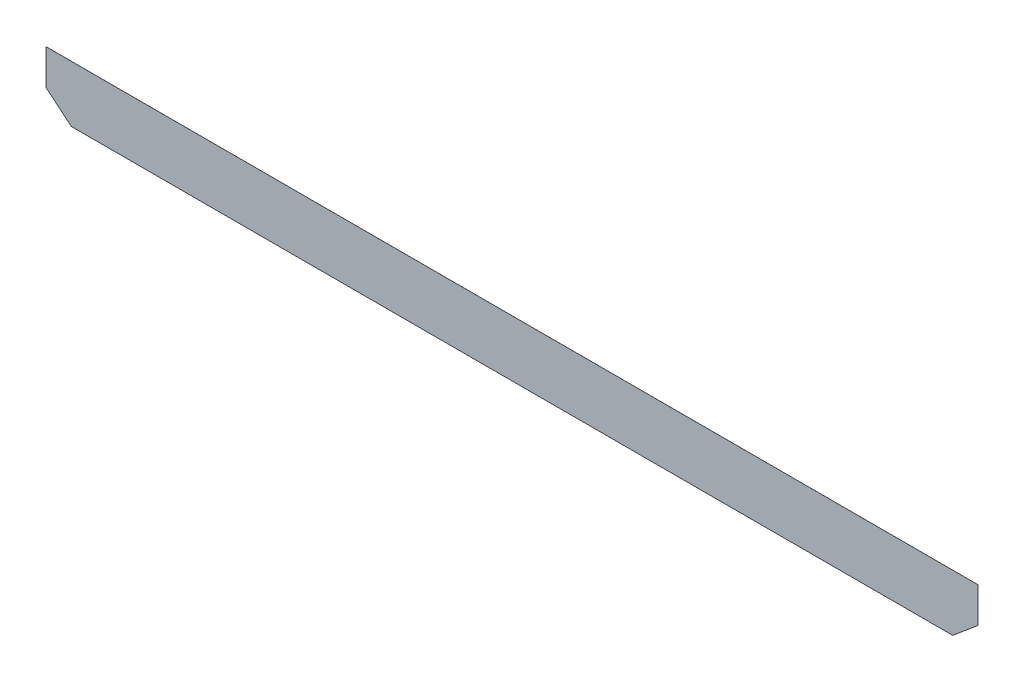
ISO-10303-21;
HEADER;
FILE_DESCRIPTION(('STEP AP214'),'2;1');
FILE_NAME('part.step','',(''),(''),'','','');
FILE_SCHEMA(('AUTOMOTIVE_DESIGN { 1 0 10303 214 1 1 1 1 }'));
ENDSEC;
DATA;
#1=APPLICATION_CONTEXT('core data for automotive mechanical design processes');
#2=APPLICATION_PROTOCOL_DEFINITION('international standard','automotive_design',2000,#1);
#3=PRODUCT_CONTEXT('',#1,'mechanical');
#4=PRODUCT('Part','Part','',(#3));
#5=PRODUCT_RELATED_PRODUCT_CATEGORY('part','',(#4));
#6=PRODUCT_DEFINITION_FORMATION('','',#4);
#7=PRODUCT_DEFINITION_CONTEXT('part definition',#1,'design');
#8=PRODUCT_DEFINITION('design','',#6,#7);
#9=PRODUCT_DEFINITION_SHAPE('','',#8);
#10=(LENGTH_UNIT() NAMED_UNIT(*) SI_UNIT(.MILLI.,.METRE.));
#11=(NAMED_UNIT(*) PLANE_ANGLE_UNIT() SI_UNIT($,.RADIAN.));
#12=(NAMED_UNIT(*) SI_UNIT($,.STERADIAN.) SOLID_ANGLE_UNIT());
#13=UNCERTAINTY_MEASURE_WITH_UNIT(LENGTH_MEASURE(1.E-05),#10,'distance_accuracy_value','');
#14=(GEOMETRIC_REPRESENTATION_CONTEXT(3) GLOBAL_UNCERTAINTY_ASSIGNED_CONTEXT((#13)) GLOBAL_UNIT_ASSIGNED_CONTEXT((#10,
#11,#12)) REPRESENTATION_CONTEXT('',''));
#15=CARTESIAN_POINT('',(0.,0.,0.));
#16=DIRECTION('',(0.,0.,1.));
#17=DIRECTION('',(1.,0.,0.));
#18=AXIS2_PLACEMENT_3D('',#15,#16,#17);
#19=CARTESIAN_POINT('',(0.,0.,0.001));
#20=DIRECTION('',(0.,1.,0.));
#21=DIRECTION('',(0.,0.,1.));
#22=AXIS2_PLACEMENT_3D('',#19,#20,#21);
#23=PLANE('',#22);
#24=DIRECTION('',(0.,0.,-1.));
#25=VECTOR('',#24,1.);
#26=CARTESIAN_POINT('',(32.1061848055544,0.,1.));
#27=LINE('',#26,#25);
#28=CARTESIAN_POINT('',(32.1061848055544,0.,0.000999999999999916));
#29=VERTEX_POINT('',#28);
#30=CARTESIAN_POINT('',(32.1061848055544,0.,0.));
#31=VERTEX_POINT('',#30);
#32=EDGE_CURVE('E55',#29,#31,#27,.T.);
#33=ORIENTED_EDGE('',*,*,#32,.F.);
#34=DIRECTION('',(1.,0.,0.));
#35=VECTOR('',#34,1.);
#36=CARTESIAN_POINT('',(0.,0.,0.001));
#37=LINE('',#36,#35);
#38=CARTESIAN_POINT('',(0.893815194445653,0.,0.000999999999999916));
#39=VERTEX_POINT('',#38);
#40=EDGE_CURVE('E137',#39,#29,#37,.T.);
#41=ORIENTED_EDGE('',*,*,#40,.F.);
#42=DIRECTION('',(0.,0.,-1.));
#43=VECTOR('',#42,1.);
#44=CARTESIAN_POINT('',(0.893815194445653,0.,1.));
#45=LINE('',#44,#43);
#46=CARTESIAN_POINT('',(0.893815194445653,0.,0.));
#47=VERTEX_POINT('',#46);
#48=EDGE_CURVE('E157',#39,#47,#45,.T.);
#49=ORIENTED_EDGE('',*,*,#48,.T.);
#50=DIRECTION('',(1.,0.,0.));
#51=VECTOR('',#50,1.);
#52=CARTESIAN_POINT('',(0.,0.,0.));
#53=LINE('',#52,#51);
#54=EDGE_CURVE('E115',#47,#31,#53,.T.);
#55=ORIENTED_EDGE('',*,*,#54,.T.);
#56=EDGE_LOOP('',(#33,#41,#49,#55));
#57=FACE_BOUND('',#56,.T.);
#58=ADVANCED_FACE('F39',(#57),#23,.F.);
#59=CARTESIAN_POINT('',(33.,0.,0.001));
#60=DIRECTION('',(-1.,0.,0.));
#61=DIRECTION('',(0.,0.,1.));
#62=AXIS2_PLACEMENT_3D('',#59,#60,#61);
#63=PLANE('',#62);
#64=DIRECTION('',(0.,0.,-1.));
#65=VECTOR('',#64,1.);
#66=CARTESIAN_POINT('',(33.,0.749999999999994,1.));
#67=LINE('',#66,#65);
#68=CARTESIAN_POINT('',(33.,0.749999999999994,0.000999999999999916));
#69=VERTEX_POINT('',#68);
#70=CARTESIAN_POINT('',(33.,0.749999999999994,0.));
#71=VERTEX_POINT('',#70);
#72=EDGE_CURVE('E93',#69,#71,#67,.T.);
#73=ORIENTED_EDGE('',*,*,#72,.T.);
#74=DIRECTION('',(0.,1.,0.));
#75=VECTOR('',#74,1.);
#76=CARTESIAN_POINT('',(33.,0.,0.));
#77=LINE('',#76,#75);
#78=CARTESIAN_POINT('',(33.,2.,0.));
#79=VERTEX_POINT('',#78);
#80=EDGE_CURVE('E106',#71,#79,#77,.T.);
#81=ORIENTED_EDGE('',*,*,#80,.T.);
#82=DIRECTION('',(0.,0.,-1.));
#83=VECTOR('',#82,1.);
#84=CARTESIAN_POINT('',(33.,2.,0.001));
#85=LINE('',#84,#83);
#86=CARTESIAN_POINT('',(33.,2.,0.001));
#87=VERTEX_POINT('',#86);
#88=EDGE_CURVE('E11',#87,#79,#85,.T.);
#89=ORIENTED_EDGE('',*,*,#88,.F.);
#90=DIRECTION('',(0.,1.,0.));
#91=VECTOR('',#90,1.);
#92=CARTESIAN_POINT('',(33.,0.,0.001));
#93=LINE('',#92,#91);
#94=EDGE_CURVE('E107',#69,#87,#93,.T.);
#95=ORIENTED_EDGE('',*,*,#94,.F.);
#96=EDGE_LOOP('',(#73,#81,#89,#95));
#97=FACE_BOUND('',#96,.T.);
#98=ADVANCED_FACE('F104',(#97),#63,.F.);
#99=CARTESIAN_POINT('',(0.,0.,0.001));
#100=DIRECTION('',(0.,0.,-1.));
#101=DIRECTION('',(-1.,0.,0.));
#102=AXIS2_PLACEMENT_3D('',#99,#100,#101);
#103=PLANE('',#102);
#104=DIRECTION('',(-0.766044443118977,-0.642787609686541,0.));
#105=VECTOR('',#104,1.);
#106=CARTESIAN_POINT('',(13.2655021611161,-15.8092098580763,0.001));
#107=LINE('',#106,#105);
#108=EDGE_CURVE('E141',#69,#29,#107,.T.);
#109=ORIENTED_EDGE('',*,*,#108,.F.);
#110=ORIENTED_EDGE('',*,*,#94,.T.);
#111=DIRECTION('',(-1.,0.,0.));
#112=VECTOR('',#111,1.);
#113=CARTESIAN_POINT('',(0.,2.,0.001));
#114=LINE('',#113,#112);
#115=CARTESIAN_POINT('',(0.,2.,0.001));
#116=VERTEX_POINT('',#115);
#117=EDGE_CURVE('E126',#87,#116,#114,.T.);
#118=ORIENTED_EDGE('',*,*,#117,.T.);
#119=DIRECTION('',(0.,-1.,0.));
#120=VECTOR('',#119,1.);
#121=CARTESIAN_POINT('',(0.,0.,0.001));
#122=LINE('',#121,#120);
#123=CARTESIAN_POINT('',(0.,0.75,0.000999999999999916));
#124=VERTEX_POINT('',#123);
#125=EDGE_CURVE('E119',#116,#124,#122,.T.);
#126=ORIENTED_EDGE('',*,*,#125,.T.);
#127=DIRECTION('',(0.766044443118976,-0.642787609686541,0.));
#128=VECTOR('',#127,1.);
#129=CARTESIAN_POINT('',(0.369302907379578,0.440118066625097,0.001));
#130=LINE('',#129,#128);
#131=EDGE_CURVE('E143',#124,#39,#130,.T.);
#132=ORIENTED_EDGE('',*,*,#131,.T.);
#133=ORIENTED_EDGE('',*,*,#40,.T.);
#134=EDGE_LOOP('',(#109,#110,#118,#126,#132,#133));
#135=FACE_BOUND('',#134,.T.);
#136=ADVANCED_FACE('F154',(#135),#103,.F.);
#137=CARTESIAN_POINT('',(0.,0.,0.));
#138=DIRECTION('',(0.,0.,-1.));
#139=DIRECTION('',(-1.,0.,0.));
#140=AXIS2_PLACEMENT_3D('',#137,#138,#139);
#141=PLANE('',#140);
#142=ORIENTED_EDGE('',*,*,#80,.F.);
#143=DIRECTION('',(-0.766044443118976,-0.642787609686541,0.));
#144=VECTOR('',#143,1.);
#145=CARTESIAN_POINT('',(13.2655021611161,-15.8092098580764,0.));
#146=LINE('',#145,#144);
#147=EDGE_CURVE('E90',#71,#31,#146,.T.);
#148=ORIENTED_EDGE('',*,*,#147,.T.);
#149=ORIENTED_EDGE('',*,*,#54,.F.);
#150=DIRECTION('',(0.766044443118977,-0.642787609686541,0.));
#151=VECTOR('',#150,1.);
#152=CARTESIAN_POINT('',(0.,0.75,0.));
#153=LINE('',#152,#151);
#154=CARTESIAN_POINT('',(0.,0.75,0.));
#155=VERTEX_POINT('',#154);
#156=EDGE_CURVE('E100',#155,#47,#153,.T.);
#157=ORIENTED_EDGE('',*,*,#156,.F.);
#158=DIRECTION('',(0.,-1.,0.));
#159=VECTOR('',#158,1.);
#160=CARTESIAN_POINT('',(0.,0.,0.));
#161=LINE('',#160,#159);
#162=CARTESIAN_POINT('',(0.,2.,0.));
#163=VERTEX_POINT('',#162);
#164=EDGE_CURVE('E121',#163,#155,#161,.T.);
#165=ORIENTED_EDGE('',*,*,#164,.F.);
#166=DIRECTION('',(-1.,0.,0.));
#167=VECTOR('',#166,1.);
#168=CARTESIAN_POINT('',(0.,2.,0.));
#169=LINE('',#168,#167);
#170=EDGE_CURVE('E113',#79,#163,#169,.T.);
#171=ORIENTED_EDGE('',*,*,#170,.F.);
#172=EDGE_LOOP('',(#142,#148,#149,#157,#165,#171));
#173=FACE_BOUND('',#172,.T.);
#174=ADVANCED_FACE('F111',(#173),#141,.T.);
#175=CARTESIAN_POINT('',(0.,0.,0.001));
#176=DIRECTION('',(1.,0.,0.));
#177=DIRECTION('',(0.,0.,-1.));
#178=AXIS2_PLACEMENT_3D('',#175,#176,#177);
#179=PLANE('',#178);
#180=ORIENTED_EDGE('',*,*,#164,.T.);
#181=DIRECTION('',(0.,0.,-1.));
#182=VECTOR('',#181,1.);
#183=CARTESIAN_POINT('',(0.,0.75,1.));
#184=LINE('',#183,#182);
#185=EDGE_CURVE('E63',#124,#155,#184,.T.);
#186=ORIENTED_EDGE('',*,*,#185,.F.);
#187=ORIENTED_EDGE('',*,*,#125,.F.);
#188=DIRECTION('',(0.,0.,-1.));
#189=VECTOR('',#188,1.);
#190=CARTESIAN_POINT('',(0.,2.,0.001));
#191=LINE('',#190,#189);
#192=EDGE_CURVE('E48',#116,#163,#191,.T.);
#193=ORIENTED_EDGE('',*,*,#192,.T.);
#194=EDGE_LOOP('',(#180,#186,#187,#193));
#195=FACE_BOUND('',#194,.T.);
#196=ADVANCED_FACE('F41',(#195),#179,.F.);
#197=CARTESIAN_POINT('',(0.,2.,0.001));
#198=DIRECTION('',(0.,-1.,0.));
#199=DIRECTION('',(0.,0.,-1.));
#200=AXIS2_PLACEMENT_3D('',#197,#198,#199);
#201=PLANE('',#200);
#202=ORIENTED_EDGE('',*,*,#170,.T.);
#203=ORIENTED_EDGE('',*,*,#192,.F.);
#204=ORIENTED_EDGE('',*,*,#117,.F.);
#205=ORIENTED_EDGE('',*,*,#88,.T.);
#206=EDGE_LOOP('',(#202,#203,#204,#205));
#207=FACE_BOUND('',#206,.T.);
#208=ADVANCED_FACE('F167',(#207),#201,.F.);
#209=CARTESIAN_POINT('',(0.,0.75,1.));
#210=DIRECTION('',(0.642787609686541,0.766044443118977,0.));
#211=DIRECTION('',(-0.766044443118976,0.642787609686541,0.));
#212=AXIS2_PLACEMENT_3D('',#209,#210,#211);
#213=PLANE('',#212);
#214=ORIENTED_EDGE('',*,*,#185,.T.);
#215=ORIENTED_EDGE('',*,*,#156,.T.);
#216=ORIENTED_EDGE('',*,*,#48,.F.);
#217=ORIENTED_EDGE('',*,*,#131,.F.);
#218=EDGE_LOOP('',(#214,#215,#216,#217));
#219=FACE_BOUND('',#218,.T.);
#220=ADVANCED_FACE('F165',(#219),#213,.F.);
#221=CARTESIAN_POINT('',(13.2655021611161,-15.8092098580764,1.));
#222=DIRECTION('',(0.642787609686541,-0.766044443118977,0.));
#223=DIRECTION('',(0.766044443118977,0.642787609686541,0.));
#224=AXIS2_PLACEMENT_3D('',#221,#222,#223);
#225=PLANE('',#224);
#226=ORIENTED_EDGE('',*,*,#108,.T.);
#227=ORIENTED_EDGE('',*,*,#32,.T.);
#228=ORIENTED_EDGE('',*,*,#147,.F.);
#229=ORIENTED_EDGE('',*,*,#72,.F.);
#230=EDGE_LOOP('',(#226,#227,#228,#229));
#231=FACE_BOUND('',#230,.T.);
#232=ADVANCED_FACE('F92',(#231),#225,.T.);
#233=CLOSED_SHELL('',(#58,#98,#136,#174,#196,#208,#220,#232));
#234=MANIFOLD_SOLID_BREP('B2',#233);
#235=ADVANCED_BREP_SHAPE_REPRESENTATION('',(#18,#234),#14);
#236=SHAPE_DEFINITION_REPRESENTATION(#9,#235);
ENDSEC;
END-ISO-10303-21;
